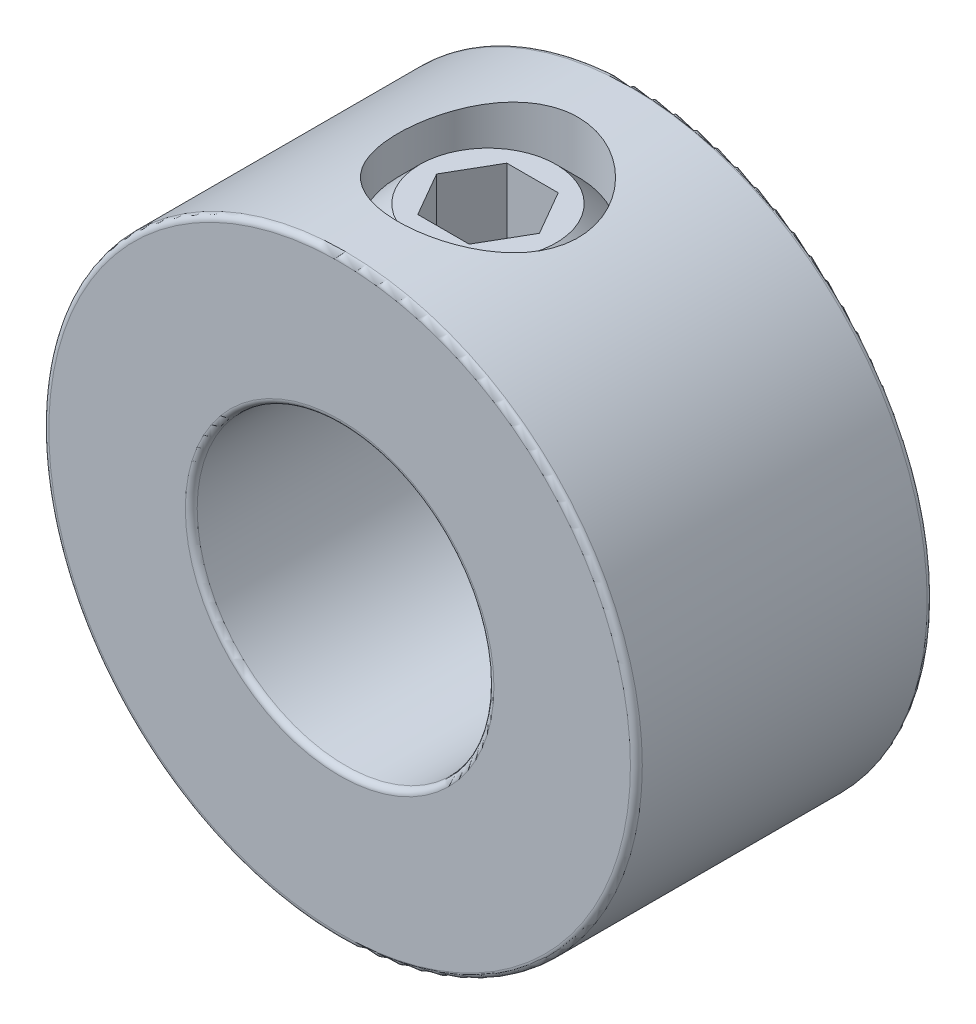
ISO-10303-21;
HEADER;
FILE_DESCRIPTION(('STEP AP214'),'2;1');
FILE_NAME('part.step','',(''),(''),'','','');
FILE_SCHEMA(('AUTOMOTIVE_DESIGN { 1 0 10303 214 1 1 1 1 }'));
ENDSEC;
DATA;
#1=APPLICATION_CONTEXT('core data for automotive mechanical design processes');
#2=APPLICATION_PROTOCOL_DEFINITION('international standard','automotive_design',2000,#1);
#3=PRODUCT_CONTEXT('',#1,'mechanical');
#4=PRODUCT('Part','Part','',(#3));
#5=PRODUCT_RELATED_PRODUCT_CATEGORY('part','',(#4));
#6=PRODUCT_DEFINITION_FORMATION('','',#4);
#7=PRODUCT_DEFINITION_CONTEXT('part definition',#1,'design');
#8=PRODUCT_DEFINITION('design','',#6,#7);
#9=PRODUCT_DEFINITION_SHAPE('','',#8);
#10=(LENGTH_UNIT() NAMED_UNIT(*) SI_UNIT(.MILLI.,.METRE.));
#11=(NAMED_UNIT(*) PLANE_ANGLE_UNIT() SI_UNIT($,.RADIAN.));
#12=(NAMED_UNIT(*) SI_UNIT($,.STERADIAN.) SOLID_ANGLE_UNIT());
#13=UNCERTAINTY_MEASURE_WITH_UNIT(LENGTH_MEASURE(1.E-05),#10,'distance_accuracy_value','');
#14=(GEOMETRIC_REPRESENTATION_CONTEXT(3) GLOBAL_UNCERTAINTY_ASSIGNED_CONTEXT((#13)) GLOBAL_UNIT_ASSIGNED_CONTEXT((#10,
#11,#12)) REPRESENTATION_CONTEXT('',''));
#15=CARTESIAN_POINT('',(0.,0.,0.));
#16=DIRECTION('',(0.,0.,1.));
#17=DIRECTION('',(1.,0.,0.));
#18=AXIS2_PLACEMENT_3D('',#15,#16,#17);
#19=CARTESIAN_POINT('',(0.,7.14375,0.));
#20=DIRECTION('',(0.,1.,0.));
#21=DIRECTION('',(-1.,0.,0.));
#22=AXIS2_PLACEMENT_3D('',#19,#20,#21);
#23=PLANE('',#22);
#24=CARTESIAN_POINT('',(0.,7.14375,0.));
#25=DIRECTION('',(0.,1.,0.));
#26=DIRECTION('',(-1.,0.,0.));
#27=AXIS2_PLACEMENT_3D('',#24,#25,#26);
#28=CIRCLE('',#27,1.81975161629017);
#29=CARTESIAN_POINT('',(-1.81975161629017,7.14375,0.));
#30=VERTEX_POINT('',#29);
#31=EDGE_CURVE('E12',#30,#30,#28,.T.);
#32=ORIENTED_EDGE('',*,*,#31,.T.);
#33=EDGE_LOOP('',(#32));
#34=FACE_BOUND('',#33,.T.);
#35=DIRECTION('',(1.,0.,0.));
#36=VECTOR('',#35,1.);
#37=CARTESIAN_POINT('',(-0.687407664253899,7.14374999999999,-1.190625));
#38=LINE('',#37,#36);
#39=CARTESIAN_POINT('',(-0.687407664253899,7.14374999999999,-1.190625));
#40=VERTEX_POINT('',#39);
#41=CARTESIAN_POINT('',(0.687407664253899,7.14375,-1.190625));
#42=VERTEX_POINT('',#41);
#43=EDGE_CURVE('E110',#40,#42,#38,.T.);
#44=ORIENTED_EDGE('',*,*,#43,.T.);
#45=DIRECTION('',(0.5,0.,0.866025403784439));
#46=VECTOR('',#45,1.);
#47=CARTESIAN_POINT('',(0.687407664253899,7.14374999999999,-1.190625));
#48=LINE('',#47,#46);
#49=CARTESIAN_POINT('',(1.3748153285078,7.14374999999999,0.));
#50=VERTEX_POINT('',#49);
#51=EDGE_CURVE('E56',#42,#50,#48,.T.);
#52=ORIENTED_EDGE('',*,*,#51,.T.);
#53=DIRECTION('',(-0.5,0.,0.866025403784439));
#54=VECTOR('',#53,1.);
#55=CARTESIAN_POINT('',(1.3748153285078,7.14374999999999,0.));
#56=LINE('',#55,#54);
#57=CARTESIAN_POINT('',(0.687407664253899,7.14374999999999,1.190625));
#58=VERTEX_POINT('',#57);
#59=EDGE_CURVE('E114',#50,#58,#56,.T.);
#60=ORIENTED_EDGE('',*,*,#59,.T.);
#61=DIRECTION('',(-1.,0.,0.));
#62=VECTOR('',#61,1.);
#63=CARTESIAN_POINT('',(0.687407664253899,7.14374999999999,1.190625));
#64=LINE('',#63,#62);
#65=CARTESIAN_POINT('',(-0.687407664253899,7.14374999999999,1.190625));
#66=VERTEX_POINT('',#65);
#67=EDGE_CURVE('E177',#58,#66,#64,.T.);
#68=ORIENTED_EDGE('',*,*,#67,.T.);
#69=DIRECTION('',(-0.5,0.,-0.866025403784439));
#70=VECTOR('',#69,1.);
#71=CARTESIAN_POINT('',(-0.687407664253899,7.14374999999999,1.190625));
#72=LINE('',#71,#70);
#73=CARTESIAN_POINT('',(-1.3748153285078,7.14374999999999,0.));
#74=VERTEX_POINT('',#73);
#75=EDGE_CURVE('E162',#66,#74,#72,.T.);
#76=ORIENTED_EDGE('',*,*,#75,.T.);
#77=DIRECTION('',(0.5,0.,-0.866025403784439));
#78=VECTOR('',#77,1.);
#79=CARTESIAN_POINT('',(-1.3748153285078,7.14374999999999,0.));
#80=LINE('',#79,#78);
#81=EDGE_CURVE('E158',#74,#40,#80,.T.);
#82=ORIENTED_EDGE('',*,*,#81,.T.);
#83=EDGE_LOOP('',(#44,#52,#60,#68,#76,#82));
#84=FACE_BOUND('',#83,.T.);
#85=ADVANCED_FACE('F42',(#34,#84),#23,.T.);
#86=CARTESIAN_POINT('',(0.,7.14375,0.));
#87=DIRECTION('',(0.,-1.,0.));
#88=DIRECTION('',(1.,0.,0.));
#89=AXIS2_PLACEMENT_3D('',#86,#87,#88);
#90=CONICAL_SURFACE('',#89,1.81975161629017,0.785398163397449);
#91=CARTESIAN_POINT('',(0.,6.55050161629017,0.));
#92=DIRECTION('',(0.,1.,0.));
#93=DIRECTION('',(-1.,0.,0.));
#94=AXIS2_PLACEMENT_3D('',#91,#92,#93);
#95=CIRCLE('',#94,2.413);
#96=CARTESIAN_POINT('',(-2.413,6.55050161629017,0.));
#97=VERTEX_POINT('',#96);
#98=EDGE_CURVE('E49',#97,#97,#95,.T.);
#99=ORIENTED_EDGE('',*,*,#98,.T.);
#100=EDGE_LOOP('',(#99));
#101=FACE_BOUND('',#100,.T.);
#102=ORIENTED_EDGE('',*,*,#31,.F.);
#103=EDGE_LOOP('',(#102));
#104=FACE_BOUND('',#103,.T.);
#105=ADVANCED_FACE('F132',(#101,#104),#90,.T.);
#106=CARTESIAN_POINT('',(0.,3.96875,0.));
#107=DIRECTION('',(0.,1.,0.));
#108=DIRECTION('',(-1.,0.,0.));
#109=AXIS2_PLACEMENT_3D('',#106,#107,#108);
#110=CYLINDRICAL_SURFACE('',#109,2.413);
#111=CARTESIAN_POINT('',(0.,4.56199838370983,0.));
#112=DIRECTION('',(0.,1.,0.));
#113=DIRECTION('',(-1.,0.,0.));
#114=AXIS2_PLACEMENT_3D('',#111,#112,#113);
#115=CIRCLE('',#114,2.413);
#116=CARTESIAN_POINT('',(-2.413,4.56199838370983,0.));
#117=VERTEX_POINT('',#116);
#118=EDGE_CURVE('E127',#117,#117,#115,.T.);
#119=ORIENTED_EDGE('',*,*,#118,.T.);
#120=EDGE_LOOP('',(#119));
#121=FACE_BOUND('',#120,.T.);
#122=ORIENTED_EDGE('',*,*,#98,.F.);
#123=EDGE_LOOP('',(#122));
#124=FACE_BOUND('',#123,.T.);
#125=ADVANCED_FACE('F135',(#121,#124),#110,.T.);
#126=CARTESIAN_POINT('',(0.,4.56199838370983,0.));
#127=DIRECTION('',(0.,1.,0.));
#128=DIRECTION('',(-1.,0.,0.));
#129=AXIS2_PLACEMENT_3D('',#126,#127,#128);
#130=CONICAL_SURFACE('',#129,2.413,0.785398163397449);
#131=CARTESIAN_POINT('',(0.,3.96875,0.));
#132=DIRECTION('',(0.,1.,0.));
#133=DIRECTION('',(-1.,0.,0.));
#134=AXIS2_PLACEMENT_3D('',#131,#132,#133);
#135=CIRCLE('',#134,1.81975161629017);
#136=CARTESIAN_POINT('',(-1.81975161629017,3.96875,0.));
#137=VERTEX_POINT('',#136);
#138=EDGE_CURVE('E119',#137,#137,#135,.T.);
#139=ORIENTED_EDGE('',*,*,#138,.T.);
#140=EDGE_LOOP('',(#139));
#141=FACE_BOUND('',#140,.T.);
#142=ORIENTED_EDGE('',*,*,#118,.F.);
#143=EDGE_LOOP('',(#142));
#144=FACE_BOUND('',#143,.T.);
#145=ADVANCED_FACE('F137',(#141,#144),#130,.T.);
#146=CARTESIAN_POINT('',(-1.81975161629017,3.96875,0.));
#147=DIRECTION('',(0.,-1.,0.));
#148=DIRECTION('',(1.,0.,0.));
#149=AXIS2_PLACEMENT_3D('',#146,#147,#148);
#150=PLANE('',#149);
#151=CARTESIAN_POINT('',(0.,3.96875,0.));
#152=DIRECTION('',(0.,1.,0.));
#153=DIRECTION('',(-1.,0.,0.));
#154=AXIS2_PLACEMENT_3D('',#151,#152,#153);
#155=CIRCLE('',#154,0.711898060451796);
#156=CARTESIAN_POINT('',(-0.711898060451796,3.96875,0.));
#157=VERTEX_POINT('',#156);
#158=EDGE_CURVE('E115',#157,#157,#155,.T.);
#159=ORIENTED_EDGE('',*,*,#158,.T.);
#160=EDGE_LOOP('',(#159));
#161=FACE_BOUND('',#160,.T.);
#162=ORIENTED_EDGE('',*,*,#138,.F.);
#163=EDGE_LOOP('',(#162));
#164=FACE_BOUND('',#163,.T.);
#165=ADVANCED_FACE('F144',(#161,#164),#150,.T.);
#166=CARTESIAN_POINT('',(0.,3.96875,0.));
#167=DIRECTION('',(0.,-1.,0.));
#168=DIRECTION('',(1.,0.,0.));
#169=AXIS2_PLACEMENT_3D('',#166,#167,#168);
#170=CONICAL_SURFACE('',#169,0.711898060451796,0.785398163397448);
#171=CARTESIAN_POINT('',(0.,4.6806480604518,0.));
#172=VERTEX_POINT('',#171);
#173=VERTEX_LOOP('',#172);
#174=FACE_BOUND('',#173,.T.);
#175=ORIENTED_EDGE('',*,*,#158,.F.);
#176=EDGE_LOOP('',(#175));
#177=FACE_BOUND('',#176,.T.);
#178=ADVANCED_FACE('F211',(#174,#177),#170,.F.);
#179=CARTESIAN_POINT('',(0.687407664253899,4.76249999999999,-1.190625));
#180=DIRECTION('',(-0.866025403784439,0.,0.5));
#181=DIRECTION('',(0.5,0.,0.866025403784438));
#182=AXIS2_PLACEMENT_3D('',#179,#180,#181);
#183=PLANE('',#182);
#184=ORIENTED_EDGE('',*,*,#51,.F.);
#185=DIRECTION('',(0.,1.,0.));
#186=VECTOR('',#185,1.);
#187=CARTESIAN_POINT('',(0.687407664253899,4.76249999999999,-1.190625));
#188=LINE('',#187,#186);
#189=CARTESIAN_POINT('',(0.687407664253899,4.76249999999999,-1.190625));
#190=VERTEX_POINT('',#189);
#191=EDGE_CURVE('E109',#190,#42,#188,.T.);
#192=ORIENTED_EDGE('',*,*,#191,.F.);
#193=DIRECTION('',(0.5,0.,0.866025403784439));
#194=VECTOR('',#193,1.);
#195=CARTESIAN_POINT('',(0.687407664253899,4.76249999999999,-1.190625));
#196=LINE('',#195,#194);
#197=CARTESIAN_POINT('',(1.3748153285078,4.76249999999999,0.));
#198=VERTEX_POINT('',#197);
#199=EDGE_CURVE('E100',#190,#198,#196,.T.);
#200=ORIENTED_EDGE('',*,*,#199,.T.);
#201=DIRECTION('',(0.,1.,0.));
#202=VECTOR('',#201,1.);
#203=CARTESIAN_POINT('',(1.3748153285078,4.76249999999999,0.));
#204=LINE('',#203,#202);
#205=EDGE_CURVE('E108',#198,#50,#204,.T.);
#206=ORIENTED_EDGE('',*,*,#205,.T.);
#207=EDGE_LOOP('',(#184,#192,#200,#206));
#208=FACE_BOUND('',#207,.T.);
#209=ADVANCED_FACE('F107',(#208),#183,.T.);
#210=CARTESIAN_POINT('',(1.3748153285078,4.76249999999999,0.));
#211=DIRECTION('',(-0.866025403784439,0.,-0.5));
#212=DIRECTION('',(-0.5,0.,0.866025403784439));
#213=AXIS2_PLACEMENT_3D('',#210,#211,#212);
#214=PLANE('',#213);
#215=ORIENTED_EDGE('',*,*,#59,.F.);
#216=ORIENTED_EDGE('',*,*,#205,.F.);
#217=DIRECTION('',(-0.5,0.,0.866025403784439));
#218=VECTOR('',#217,1.);
#219=CARTESIAN_POINT('',(1.3748153285078,4.76249999999999,0.));
#220=LINE('',#219,#218);
#221=CARTESIAN_POINT('',(0.687407664253899,4.76249999999999,1.190625));
#222=VERTEX_POINT('',#221);
#223=EDGE_CURVE('E96',#198,#222,#220,.T.);
#224=ORIENTED_EDGE('',*,*,#223,.T.);
#225=DIRECTION('',(0.,1.,0.));
#226=VECTOR('',#225,1.);
#227=CARTESIAN_POINT('',(0.687407664253899,4.76249999999999,1.190625));
#228=LINE('',#227,#226);
#229=EDGE_CURVE('E116',#222,#58,#228,.T.);
#230=ORIENTED_EDGE('',*,*,#229,.T.);
#231=EDGE_LOOP('',(#215,#216,#224,#230));
#232=FACE_BOUND('',#231,.T.);
#233=ADVANCED_FACE('F112',(#232),#214,.T.);
#234=CARTESIAN_POINT('',(0.687407664253899,4.76249999999999,1.190625));
#235=DIRECTION('',(0.,0.,-1.));
#236=DIRECTION('',(-1.,0.,0.));
#237=AXIS2_PLACEMENT_3D('',#234,#235,#236);
#238=PLANE('',#237);
#239=ORIENTED_EDGE('',*,*,#67,.F.);
#240=ORIENTED_EDGE('',*,*,#229,.F.);
#241=DIRECTION('',(-1.,0.,0.));
#242=VECTOR('',#241,1.);
#243=CARTESIAN_POINT('',(0.687407664253899,4.76249999999999,1.190625));
#244=LINE('',#243,#242);
#245=CARTESIAN_POINT('',(-0.687407664253899,4.76249999999999,1.190625));
#246=VERTEX_POINT('',#245);
#247=EDGE_CURVE('E102',#222,#246,#244,.T.);
#248=ORIENTED_EDGE('',*,*,#247,.T.);
#249=DIRECTION('',(0.,1.,0.));
#250=VECTOR('',#249,1.);
#251=CARTESIAN_POINT('',(-0.687407664253899,4.76249999999999,1.190625));
#252=LINE('',#251,#250);
#253=EDGE_CURVE('E121',#246,#66,#252,.T.);
#254=ORIENTED_EDGE('',*,*,#253,.T.);
#255=EDGE_LOOP('',(#239,#240,#248,#254));
#256=FACE_BOUND('',#255,.T.);
#257=ADVANCED_FACE('F175',(#256),#238,.T.);
#258=CARTESIAN_POINT('',(-0.687407664253899,4.76249999999999,1.190625));
#259=DIRECTION('',(0.866025403784439,0.,-0.5));
#260=DIRECTION('',(-0.5,0.,-0.866025403784438));
#261=AXIS2_PLACEMENT_3D('',#258,#259,#260);
#262=PLANE('',#261);
#263=ORIENTED_EDGE('',*,*,#75,.F.);
#264=ORIENTED_EDGE('',*,*,#253,.F.);
#265=DIRECTION('',(-0.5,0.,-0.866025403784439));
#266=VECTOR('',#265,1.);
#267=CARTESIAN_POINT('',(-0.687407664253899,4.76249999999999,1.190625));
#268=LINE('',#267,#266);
#269=CARTESIAN_POINT('',(-1.3748153285078,4.76249999999999,0.));
#270=VERTEX_POINT('',#269);
#271=EDGE_CURVE('E188',#246,#270,#268,.T.);
#272=ORIENTED_EDGE('',*,*,#271,.T.);
#273=DIRECTION('',(0.,1.,0.));
#274=VECTOR('',#273,1.);
#275=CARTESIAN_POINT('',(-1.3748153285078,4.76249999999999,0.));
#276=LINE('',#275,#274);
#277=EDGE_CURVE('E170',#270,#74,#276,.T.);
#278=ORIENTED_EDGE('',*,*,#277,.T.);
#279=EDGE_LOOP('',(#263,#264,#272,#278));
#280=FACE_BOUND('',#279,.T.);
#281=ADVANCED_FACE('F179',(#280),#262,.T.);
#282=CARTESIAN_POINT('',(-1.3748153285078,4.76249999999999,0.));
#283=DIRECTION('',(0.866025403784439,0.,0.5));
#284=DIRECTION('',(0.5,0.,-0.866025403784439));
#285=AXIS2_PLACEMENT_3D('',#282,#283,#284);
#286=PLANE('',#285);
#287=ORIENTED_EDGE('',*,*,#81,.F.);
#288=ORIENTED_EDGE('',*,*,#277,.F.);
#289=DIRECTION('',(0.5,0.,-0.866025403784439));
#290=VECTOR('',#289,1.);
#291=CARTESIAN_POINT('',(-1.3748153285078,4.76249999999999,0.));
#292=LINE('',#291,#290);
#293=CARTESIAN_POINT('',(-0.687407664253899,4.76249999999999,-1.190625));
#294=VERTEX_POINT('',#293);
#295=EDGE_CURVE('E186',#270,#294,#292,.T.);
#296=ORIENTED_EDGE('',*,*,#295,.T.);
#297=DIRECTION('',(0.,1.,0.));
#298=VECTOR('',#297,1.);
#299=CARTESIAN_POINT('',(-0.687407664253899,4.76249999999999,-1.190625));
#300=LINE('',#299,#298);
#301=EDGE_CURVE('E167',#294,#40,#300,.T.);
#302=ORIENTED_EDGE('',*,*,#301,.T.);
#303=EDGE_LOOP('',(#287,#288,#296,#302));
#304=FACE_BOUND('',#303,.T.);
#305=ADVANCED_FACE('F192',(#304),#286,.T.);
#306=CARTESIAN_POINT('',(-0.687407664253899,4.76249999999999,-1.190625));
#307=DIRECTION('',(0.,0.,1.));
#308=DIRECTION('',(1.,0.,0.));
#309=AXIS2_PLACEMENT_3D('',#306,#307,#308);
#310=PLANE('',#309);
#311=ORIENTED_EDGE('',*,*,#43,.F.);
#312=ORIENTED_EDGE('',*,*,#301,.F.);
#313=DIRECTION('',(1.,0.,0.));
#314=VECTOR('',#313,1.);
#315=CARTESIAN_POINT('',(-0.687407664253899,4.76249999999999,-1.190625));
#316=LINE('',#315,#314);
#317=EDGE_CURVE('E168',#294,#190,#316,.T.);
#318=ORIENTED_EDGE('',*,*,#317,.T.);
#319=ORIENTED_EDGE('',*,*,#191,.T.);
#320=EDGE_LOOP('',(#311,#312,#318,#319));
#321=FACE_BOUND('',#320,.T.);
#322=ADVANCED_FACE('F193',(#321),#310,.T.);
#323=CARTESIAN_POINT('',(1.3748153285078,4.76249999999999,0.));
#324=DIRECTION('',(0.,-1.,0.));
#325=DIRECTION('',(0.,0.,-1.));
#326=AXIS2_PLACEMENT_3D('',#323,#324,#325);
#327=PLANE('',#326);
#328=ORIENTED_EDGE('',*,*,#199,.F.);
#329=ORIENTED_EDGE('',*,*,#317,.F.);
#330=ORIENTED_EDGE('',*,*,#295,.F.);
#331=ORIENTED_EDGE('',*,*,#271,.F.);
#332=ORIENTED_EDGE('',*,*,#247,.F.);
#333=ORIENTED_EDGE('',*,*,#223,.F.);
#334=EDGE_LOOP('',(#328,#329,#330,#331,#332,#333));
#335=FACE_BOUND('',#334,.T.);
#336=ADVANCED_FACE('F98',(#335),#327,.F.);
#337=CLOSED_SHELL('',(#85,#105,#125,#145,#165,#178,#209,#233,#257,#281,#305,#322,#336));
#338=MANIFOLD_SOLID_BREP('B2',#337);
#339=CARTESIAN_POINT('',(0.,0.,3.96875));
#340=DIRECTION('',(0.,0.,1.));
#341=DIRECTION('',(1.,0.,0.));
#342=AXIS2_PLACEMENT_3D('',#339,#340,#341);
#343=PLANE('',#342);
#344=CARTESIAN_POINT('',(0.,0.,3.96875));
#345=DIRECTION('',(0.,0.,1.));
#346=DIRECTION('',(1.,0.,0.));
#347=AXIS2_PLACEMENT_3D('',#344,#345,#346);
#348=CIRCLE('',#347,4.1275);
#349=CARTESIAN_POINT('',(4.1275,0.,3.96875));
#350=VERTEX_POINT('',#349);
#351=EDGE_CURVE('E307',#350,#350,#348,.F.);
#352=ORIENTED_EDGE('',*,*,#351,.T.);
#353=EDGE_LOOP('',(#352));
#354=FACE_BOUND('',#353,.T.);
#355=CARTESIAN_POINT('',(0.,0.,3.96875));
#356=DIRECTION('',(0.,0.,1.));
#357=DIRECTION('',(1.,0.,0.));
#358=AXIS2_PLACEMENT_3D('',#355,#356,#357);
#359=CIRCLE('',#358,7.77875);
#360=CARTESIAN_POINT('',(7.77875,0.,3.96875));
#361=VERTEX_POINT('',#360);
#362=EDGE_CURVE('E311',#361,#361,#359,.T.);
#363=ORIENTED_EDGE('',*,*,#362,.T.);
#364=EDGE_LOOP('',(#363));
#365=FACE_BOUND('',#364,.T.);
#366=ADVANCED_FACE('F296',(#354,#365),#343,.T.);
#367=CARTESIAN_POINT('',(0.,0.,-3.96875));
#368=DIRECTION('',(0.,0.,1.));
#369=DIRECTION('',(1.,0.,0.));
#370=AXIS2_PLACEMENT_3D('',#367,#368,#369);
#371=PLANE('',#370);
#372=CARTESIAN_POINT('',(0.,0.,-3.96875));
#373=DIRECTION('',(0.,0.,1.));
#374=DIRECTION('',(1.,0.,0.));
#375=AXIS2_PLACEMENT_3D('',#372,#373,#374);
#376=CIRCLE('',#375,4.1275);
#377=CARTESIAN_POINT('',(4.1275,0.,-3.96875));
#378=VERTEX_POINT('',#377);
#379=EDGE_CURVE('E322',#378,#378,#376,.T.);
#380=ORIENTED_EDGE('',*,*,#379,.T.);
#381=EDGE_LOOP('',(#380));
#382=FACE_BOUND('',#381,.T.);
#383=CARTESIAN_POINT('',(0.,0.,-3.96875));
#384=DIRECTION('',(0.,0.,1.));
#385=DIRECTION('',(1.,0.,0.));
#386=AXIS2_PLACEMENT_3D('',#383,#384,#385);
#387=CIRCLE('',#386,7.77875);
#388=CARTESIAN_POINT('',(7.77875,0.,-3.96875));
#389=VERTEX_POINT('',#388);
#390=EDGE_CURVE('E325',#389,#389,#387,.F.);
#391=ORIENTED_EDGE('',*,*,#390,.T.);
#392=EDGE_LOOP('',(#391));
#393=FACE_BOUND('',#392,.T.);
#394=ADVANCED_FACE('F359',(#382,#393),#371,.F.);
#395=CARTESIAN_POINT('',(0.,0.,3.96875));
#396=DIRECTION('',(0.,0.,-1.));
#397=DIRECTION('',(-1.,0.,0.));
#398=AXIS2_PLACEMENT_3D('',#395,#396,#397);
#399=CYLINDRICAL_SURFACE('',#398,7.9375);
#400=CARTESIAN_POINT('',(0.,0.,-3.81));
#401=DIRECTION('',(0.,0.,1.));
#402=DIRECTION('',(1.,0.,0.));
#403=AXIS2_PLACEMENT_3D('',#400,#401,#402);
#404=CIRCLE('',#403,7.9375);
#405=CARTESIAN_POINT('',(7.9375,0.,-3.81));
#406=VERTEX_POINT('',#405);
#407=EDGE_CURVE('E41',#406,#406,#404,.T.);
#408=ORIENTED_EDGE('',*,*,#407,.T.);
#409=EDGE_LOOP('',(#408));
#410=FACE_BOUND('',#409,.T.);
#411=CARTESIAN_POINT('',(0.,0.,3.81));
#412=DIRECTION('',(0.,0.,1.));
#413=DIRECTION('',(1.,0.,0.));
#414=AXIS2_PLACEMENT_3D('',#411,#412,#413);
#415=CIRCLE('',#414,7.9375);
#416=CARTESIAN_POINT('',(7.9375,0.,3.81));
#417=VERTEX_POINT('',#416);
#418=EDGE_CURVE('E303',#417,#417,#415,.F.);
#419=ORIENTED_EDGE('',*,*,#418,.T.);
#420=EDGE_LOOP('',(#419));
#421=FACE_BOUND('',#420,.T.);
#422=CARTESIAN_POINT('',(0.,7.9375,-2.413));
#423=CARTESIAN_POINT('',(0.132292774899317,7.9374990050537,-2.41299862237628));
#424=CARTESIAN_POINT('',(0.264599518381689,7.93416116207132,-2.40208456794969));
#425=CARTESIAN_POINT('',(0.525354946013904,7.92117222946042,-2.35882374345716));
#426=CARTESIAN_POINT('',(0.653802557415082,7.91151940108894,-2.32647107053551));
#427=CARTESIAN_POINT('',(0.903041313331836,7.88695717599938,-2.24151680045489));
#428=CARTESIAN_POINT('',(1.0238436159252,7.87205565851205,-2.18894554423122));
#429=CARTESIAN_POINT('',(1.25491860814633,7.83854164816898,-2.06517231127943));
#430=CARTESIAN_POINT('',(1.36518981088764,7.81992863242886,-1.99396770900084));
#431=CARTESIAN_POINT('',(1.5753146010731,7.78036198161428,-1.83274390297987));
#432=CARTESIAN_POINT('',(1.67481494525514,7.75935941289957,-1.74227635763322));
#433=CARTESIAN_POINT('',(1.85749109856336,7.71766998618262,-1.54604996654896));
#434=CARTESIAN_POINT('',(1.9406640704021,7.69698318362761,-1.44028846864199));
#435=CARTESIAN_POINT('',(2.09020118290126,7.65774749745578,-1.21346560478497));
#436=CARTESIAN_POINT('',(2.15613096597831,7.63925929192144,-1.09210639523313));
#437=CARTESIAN_POINT('',(2.26650098404084,7.60724691943917,-0.839370407786386));
#438=CARTESIAN_POINT('',(2.31094653649145,7.59372152436824,-0.707996118007792));
#439=CARTESIAN_POINT('',(2.3758067264602,7.57367670858706,-0.442932068104457));
#440=CARTESIAN_POINT('',(2.39687388308448,7.56696751920921,-0.309416717357086));
#441=CARTESIAN_POINT('',(2.4164171516007,7.56075056418472,-0.0405910256843933));
#442=CARTESIAN_POINT('',(2.41489890338842,7.56124100068904,0.0947188586885998));
#443=CARTESIAN_POINT('',(2.38982629949606,7.56919991114954,0.357957705592921));
#444=CARTESIAN_POINT('',(2.36709319986061,7.57640830969674,0.485974062421038));
#445=CARTESIAN_POINT('',(2.30156455882043,7.59656963695107,0.736282348204517));
#446=CARTESIAN_POINT('',(2.25876698945115,7.60952314632332,0.858573697144985));
#447=CARTESIAN_POINT('',(2.15372728275048,7.63992010283533,1.09595275882303));
#448=CARTESIAN_POINT('',(2.09122148030352,7.65742383164637,1.21091575085397));
#449=CARTESIAN_POINT('',(1.94872282727374,7.6949204514905,1.42899447413862));
#450=CARTESIAN_POINT('',(1.86872564146393,7.71491395908373,1.53210725864378));
#451=CARTESIAN_POINT('',(1.68945173313376,7.75618852856768,1.72821183511834));
#452=CARTESIAN_POINT('',(1.58949459558667,7.77748801126888,1.82057882521009));
#453=CARTESIAN_POINT('',(1.37524410592773,7.81821490430143,1.98738656746316));
#454=CARTESIAN_POINT('',(1.26094980324712,7.83764219035306,2.0618261300612));
#455=CARTESIAN_POINT('',(1.0201121910355,7.87262138541946,2.19105912538642));
#456=CARTESIAN_POINT('',(0.893488365352983,7.88814506930487,2.24571066163077));
#457=CARTESIAN_POINT('',(0.632264385940609,7.91336446499524,2.3327557354663));
#458=CARTESIAN_POINT('',(0.497666531143089,7.92306184764078,2.36515565465833));
#459=CARTESIAN_POINT('',(0.229624252219485,7.93527028493288,2.40572996828062));
#460=CARTESIAN_POINT('',(0.09631920362542,7.93803232635549,2.41475084587308));
#461=CARTESIAN_POINT('',(-0.169910326320387,7.93679710103237,2.41068803034094));
#462=CARTESIAN_POINT('',(-0.30283485746222,7.93280076329333,2.39760737529289));
#463=CARTESIAN_POINT('',(-0.561313045757695,7.918662317796,2.35039574306306));
#464=CARTESIAN_POINT('',(-0.686966276089901,7.9086655503028,2.31676225166702));
#465=CARTESIAN_POINT('',(-0.930816403381333,7.88368716256098,2.23000090507394));
#466=CARTESIAN_POINT('',(-1.04901239362654,7.86870493752267,2.17687068463324));
#467=CARTESIAN_POINT('',(-1.27768494619444,7.83486511139573,2.05122165093958));
#468=CARTESIAN_POINT('',(-1.38791430468818,7.81592458790179,1.97827588105506));
#469=CARTESIAN_POINT('',(-1.59485450866657,7.77634000763052,1.81558313194289));
#470=CARTESIAN_POINT('',(-1.69156186567424,7.75569551343041,1.72583183105413));
#471=CARTESIAN_POINT('',(-1.87245924486539,7.71406179196385,1.52809707336634));
#472=CARTESIAN_POINT('',(-1.95604664764415,7.69308849985636,1.41955774085528));
#473=CARTESIAN_POINT('',(-2.10386717742399,7.65398694583366,1.18953707022205));
#474=CARTESIAN_POINT('',(-2.16810075387635,7.63585861785491,1.06805603273204));
#475=CARTESIAN_POINT('',(-2.27496230406853,7.6047061861998,0.815946913466264));
#476=CARTESIAN_POINT('',(-2.31768600255476,7.59165952754718,0.685362356123388));
#477=CARTESIAN_POINT('',(-2.38040189821885,7.57223163077592,0.418379500826614));
#478=CARTESIAN_POINT('',(-2.40040215315239,7.56584802999566,0.281983281505183));
#479=CARTESIAN_POINT('',(-2.41654573186451,7.56070606206809,0.0135215462387282));
#480=CARTESIAN_POINT('',(-2.41367335403041,7.56163307372804,-0.11847951451985));
#481=CARTESIAN_POINT('',(-2.38651114002636,7.57024895804181,-0.380023066349805));
#482=CARTESIAN_POINT('',(-2.36222220501566,7.57793754618407,-0.509565660633487));
#483=CARTESIAN_POINT('',(-2.29355931064324,7.5989964058365,-0.76085836843846));
#484=CARTESIAN_POINT('',(-2.24945261375918,7.61229093341087,-0.882688328499914));
#485=CARTESIAN_POINT('',(-2.14261496851981,7.64304804543904,-1.11731626044873));
#486=CARTESIAN_POINT('',(-2.07988038265957,7.66051144382583,-1.23011246282902));
#487=CARTESIAN_POINT('',(-1.93482964223909,7.69845124150092,-1.44802165282358));
#488=CARTESIAN_POINT('',(-1.85187057120019,7.71901570680081,-1.55269133387613));
#489=CARTESIAN_POINT('',(-1.66987475949574,7.76042016207134,-1.74694286232239));
#490=CARTESIAN_POINT('',(-1.57083380768261,7.78126022289201,-1.83652074527573));
#491=CARTESIAN_POINT('',(-1.35587248164352,7.82162492221923,-2.00075462812685));
#492=CARTESIAN_POINT('',(-1.239531599163,7.84109057268621,-2.07487627262594));
#493=CARTESIAN_POINT('',(-0.995447775442171,7.87579500420969,-2.20240594981202));
#494=CARTESIAN_POINT('',(-0.867709932888345,7.89103566300204,-2.25582318848638));
#495=CARTESIAN_POINT('',(-0.617657643652073,7.91432673031083,-2.33592468921693));
#496=CARTESIAN_POINT('',(-0.496078219783341,7.92294375396858,-2.364748063768));
#497=CARTESIAN_POINT('',(-0.249669622610166,7.93453035635686,-2.40328467078255));
#498=CARTESIAN_POINT('',(-0.12484103093866,7.93750093890329,-2.41300130002538));
#499=CARTESIAN_POINT('',(0.,7.9375,-2.413));
#500=B_SPLINE_CURVE_WITH_KNOTS('',3,(#422,#423,#424,#425,#426,#427,#428,#429,#430,#431,#432,
#433,#434,#435,#436,#437,#438,#439,#440,#441,#442,#443,#444,#445,#446,#447,#448,#449,#450,#451,
#452,#453,#454,#455,#456,#457,#458,#459,#460,#461,#462,#463,#464,#465,#466,#467,#468,#469,#470,
#471,#472,#473,#474,#475,#476,#477,#478,#479,#480,#481,#482,#483,#484,#485,#486,#487,#488,#489,
#490,#491,#492,#493,#494,#495,#496,#497,#498,#499),.UNSPECIFIED.,.T.,.F.,(4,2,2,2,2,2,2,2,2,2,2,
2,2,2,2,2,2,2,2,2,2,2,2,2,2,2,2,2,2,2,2,2,2,2,2,2,2,2,4),(0.,0.396419658797233,
0.792948512171322,1.18888462342481,1.5848765545249,1.99135590349126,2.39790582595712,
2.81388034303934,3.22975185135954,3.63369866570383,4.03754461049548,4.42637821024115,
4.81525111881571,5.20956461414611,5.60397595080319,6.01532502722272,6.42670139093795,
6.84097182422919,7.25512339812399,7.65405578815865,8.0529333454106,8.44251867756104,
8.83215128784881,9.230955625767,9.62986266023801,10.0436726713234,10.4574730718142,
10.8694153009928,11.2812114094117,11.6753852663269,12.0695425381084,12.4585367217993,
12.8476069151672,13.2511843609796,13.6548676571655,14.0707821958696,14.486511589997,
14.8606683757548,15.2347586382522),.UNSPECIFIED.);
#501=CARTESIAN_POINT('',(0.,7.9375,-2.413));
#502=VERTEX_POINT('',#501);
#503=EDGE_CURVE('E328',#502,#502,#500,.T.);
#504=ORIENTED_EDGE('',*,*,#503,.T.);
#505=EDGE_LOOP('',(#504));
#506=FACE_BOUND('',#505,.T.);
#507=ADVANCED_FACE('F355',(#410,#421,#506),#399,.T.);
#508=CARTESIAN_POINT('',(0.,0.,3.96875));
#509=DIRECTION('',(0.,0.,-1.));
#510=DIRECTION('',(-1.,0.,0.));
#511=AXIS2_PLACEMENT_3D('',#508,#509,#510);
#512=CYLINDRICAL_SURFACE('',#511,3.96875);
#513=CARTESIAN_POINT('',(0.,0.,-3.81));
#514=DIRECTION('',(0.,0.,1.));
#515=DIRECTION('',(1.,0.,0.));
#516=AXIS2_PLACEMENT_3D('',#513,#514,#515);
#517=CIRCLE('',#516,3.96875);
#518=CARTESIAN_POINT('',(3.96875,0.,-3.81));
#519=VERTEX_POINT('',#518);
#520=EDGE_CURVE('E316',#519,#519,#517,.F.);
#521=ORIENTED_EDGE('',*,*,#520,.T.);
#522=EDGE_LOOP('',(#521));
#523=FACE_BOUND('',#522,.T.);
#524=CARTESIAN_POINT('',(0.,0.,3.81));
#525=DIRECTION('',(0.,0.,1.));
#526=DIRECTION('',(1.,0.,0.));
#527=AXIS2_PLACEMENT_3D('',#524,#525,#526);
#528=CIRCLE('',#527,3.96875);
#529=CARTESIAN_POINT('',(3.96875,0.,3.81));
#530=VERTEX_POINT('',#529);
#531=EDGE_CURVE('E319',#530,#530,#528,.T.);
#532=ORIENTED_EDGE('',*,*,#531,.T.);
#533=EDGE_LOOP('',(#532));
#534=FACE_BOUND('',#533,.T.);
#535=CARTESIAN_POINT('',(0.,3.96875,-2.413));
#536=CARTESIAN_POINT('',(0.123165501550284,3.96874204339669,-2.41299124615945));
#537=CARTESIAN_POINT('',(0.246516738261875,3.96295429853951,-2.40350384959746));
#538=CARTESIAN_POINT('',(0.489483664080046,3.94034943987807,-2.36604326559291));
#539=CARTESIAN_POINT('',(0.609090127783646,3.92350703743669,-2.33802769196767));
#540=CARTESIAN_POINT('',(0.840546582386573,3.88049577993341,-2.26510491179092));
#541=CARTESIAN_POINT('',(0.952431828991632,3.8543732029897,-2.22028146179405));
#542=CARTESIAN_POINT('',(1.16673008430404,3.79500971512363,-2.11554934419897));
#543=CARTESIAN_POINT('',(1.26914501361637,3.76177025207777,-2.05564374451438));
#544=CARTESIAN_POINT('',(1.47058753111351,3.687916691379,-1.91729289743173));
#545=CARTESIAN_POINT('',(1.56873586524913,3.64693051913672,-1.83776986476495));
#546=CARTESIAN_POINT('',(1.75115925298086,3.56293790693084,-1.66488233877126));
#547=CARTESIAN_POINT('',(1.83541593933604,3.51992888739431,-1.57149982566307));
#548=CARTESIAN_POINT('',(1.99850147891552,3.43025832872789,-1.35964489661003));
#549=CARTESIAN_POINT('',(2.07529106286855,3.38382416372775,-1.23949270263077));
#550=CARTESIAN_POINT('',(2.20731894277433,3.29922586533873,-0.985260717608268));
#551=CARTESIAN_POINT('',(2.26259272815675,3.26104815989316,-0.851204327616272));
#552=CARTESIAN_POINT('',(2.33806142410285,3.2071858977595,-0.606725086153752));
#553=CARTESIAN_POINT('',(2.3635499927685,3.18827407496012,-0.498650940719577));
#554=CARTESIAN_POINT('',(2.3994244997262,3.16137002399118,-0.27874861563771));
#555=CARTESIAN_POINT('',(2.40983000472769,3.15336364939586,-0.166925492537775));
#556=CARTESIAN_POINT('',(2.41493016649177,3.14946076169536,0.0575392620475352));
#557=CARTESIAN_POINT('',(2.40959091684864,3.15359038345178,0.170182138134826));
#558=CARTESIAN_POINT('',(2.3834758297023,3.17336918561413,0.392656374086385));
#559=CARTESIAN_POINT('',(2.36268812164138,3.18902722434164,0.502485504705744));
#560=CARTESIAN_POINT('',(2.3072582560278,3.22934546748502,0.714839170566954));
#561=CARTESIAN_POINT('',(2.27284136966713,3.2538587555979,0.817452012053584));
#562=CARTESIAN_POINT('',(2.19144263462213,3.30922547315599,1.01569946550598));
#563=CARTESIAN_POINT('',(2.14445623611994,3.34008119745013,1.11133153463737));
#564=CARTESIAN_POINT('',(2.02958239720278,3.41132068401533,1.31107139668459));
#565=CARTESIAN_POINT('',(1.95946010965428,3.45242166708182,1.41363816272798));
#566=CARTESIAN_POINT('',(1.8046098923845,3.53583156997046,1.60663550750143));
#567=CARTESIAN_POINT('',(1.71986762893658,3.57814164091738,1.69705401960805));
#568=CARTESIAN_POINT('',(1.52341346023064,3.66652895599888,1.87670279125692));
#569=CARTESIAN_POINT('',(1.40956777558015,3.71224383147173,1.96379855427126));
#570=CARTESIAN_POINT('',(1.16600981934112,3.79577231057004,2.11746058126192));
#571=CARTESIAN_POINT('',(1.03630546031566,3.83358982922035,2.18403702528473));
#572=CARTESIAN_POINT('',(0.836657404029858,3.88011810238804,2.26436147855773));
#573=CARTESIAN_POINT('',(0.771445792482796,3.89363655503471,2.28741378555035));
#574=CARTESIAN_POINT('',(0.63877705404067,3.91758471873137,2.3279461715394));
#575=CARTESIAN_POINT('',(0.571321220958915,3.92801617627651,2.34542940172032));
#576=CARTESIAN_POINT('',(0.434774063004328,3.94546326769465,2.37453334076451));
#577=CARTESIAN_POINT('',(0.36568406213146,3.95248157377129,2.38615863614474));
#578=CARTESIAN_POINT('',(0.226511162532038,3.96289656392044,2.40336960926214));
#579=CARTESIAN_POINT('',(0.156428414099685,3.966293790382,2.40895619151915));
#580=CARTESIAN_POINT('',(-0.0345875094638976,3.97042803093639,2.41576593447406));
#581=CARTESIAN_POINT('',(-0.155889645087031,3.96750179775886,2.41097308037977));
#582=CARTESIAN_POINT('',(-0.395580786800256,3.95081788580082,2.38341492656171));
#583=CARTESIAN_POINT('',(-0.513969891060856,3.93706057254972,2.36065023335502));
#584=CARTESIAN_POINT('',(-0.741302925101665,3.9005543203932,2.29924007500009));
#585=CARTESIAN_POINT('',(-0.850420645087186,3.87807562396895,2.26107063451517));
#586=CARTESIAN_POINT('',(-1.06064649564909,3.82593168660241,2.17041877534692));
#587=CARTESIAN_POINT('',(-1.16175312592156,3.79626510372601,2.11793368378936));
#588=CARTESIAN_POINT('',(-1.36438293166863,3.72853735621207,1.99412771667006));
#589=CARTESIAN_POINT('',(-1.46487371909966,3.68992598646786,1.92142252874577));
#590=CARTESIAN_POINT('',(-1.6529744799132,3.60958967643982,1.76223036727608));
#591=CARTESIAN_POINT('',(-1.74056936405613,3.56786117353918,1.67572749194951));
#592=CARTESIAN_POINT('',(-1.91261918342017,3.4790009867155,1.47780510411286));
#593=CARTESIAN_POINT('',(-1.99504642611132,3.43190199283522,1.3645979373042));
#594=CARTESIAN_POINT('',(-2.13985097603664,3.34353376432047,1.12395576920229));
#595=CARTESIAN_POINT('',(-2.20224731258024,3.3022590176874,0.99653442736945));
#596=CARTESIAN_POINT('',(-2.29344177866512,3.23936579282098,0.758458757219687));
#597=CARTESIAN_POINT('',(-2.32657866306329,3.2154293082859,0.65008626694079));
#598=CARTESIAN_POINT('',(-2.37744086245656,3.17801315216161,0.428095724280517));
#599=CARTESIAN_POINT('',(-2.39518851540099,3.16451832725394,0.314485527906917));
#600=CARTESIAN_POINT('',(-2.4142849438641,3.14997859909978,0.0845648471209729));
#601=CARTESIAN_POINT('',(-2.41556252659962,3.14898774534438,-0.0317551842091482));
#602=CARTESIAN_POINT('',(-2.40143983741951,3.15976763622633,-0.262802510402487));
#603=CARTESIAN_POINT('',(-2.38603134047097,3.17154467451613,-0.377528991515132));
#604=CARTESIAN_POINT('',(-2.34087808899904,3.20499353082565,-0.595427565837474));
#605=CARTESIAN_POINT('',(-2.31201651153951,3.22605194545112,-0.698883891062723));
#606=CARTESIAN_POINT('',(-2.24159346468759,3.27537424028443,-0.899525378863215));
#607=CARTESIAN_POINT('',(-2.20002713060506,3.30364087985553,-0.996708121970213));
#608=CARTESIAN_POINT('',(-2.09815316530071,3.36941108076951,-1.19787071136103));
#609=CARTESIAN_POINT('',(-2.03595940923333,3.40766534627249,-1.30064658521609));
#610=CARTESIAN_POINT('',(-1.89759243380594,3.48661316283012,-1.49532299960668));
#611=CARTESIAN_POINT('',(-1.8214076316638,3.52730871602022,-1.58721442476447));
#612=CARTESIAN_POINT('',(-1.64167102002946,3.61490729831683,-1.77400508435351));
#613=CARTESIAN_POINT('',(-1.53566353730284,3.66165458052152,-1.8666319309591));
#614=CARTESIAN_POINT('',(-1.30733133465839,3.74923513415245,-2.03306755896813));
#615=CARTESIAN_POINT('',(-1.18499957660471,3.7900658387457,-2.1068681833466));
#616=CARTESIAN_POINT('',(-0.992797970722944,3.84313134813152,-2.20042712586814));
#617=CARTESIAN_POINT('',(-0.927982367310503,3.85933156031422,-2.22855402350391));
#618=CARTESIAN_POINT('',(-0.795559520872516,3.88878496079137,-2.27918148009105));
#619=CARTESIAN_POINT('',(-0.727953929816715,3.90203986415944,-2.30168531434662));
#620=CARTESIAN_POINT('',(-0.590682088323656,3.92516304136075,-2.34067131568996));
#621=CARTESIAN_POINT('',(-0.521022349049394,3.93504097997536,-2.35717067631077));
#622=CARTESIAN_POINT('',(-0.380141200247729,3.95113746830425,-2.38394525421274));
#623=CARTESIAN_POINT('',(-0.308921092705835,3.95735895677176,-2.39422547012538));
#624=CARTESIAN_POINT('',(-0.197911841866967,3.96400880129109,-2.40519582144499));
#625=CARTESIAN_POINT('',(-0.158409536716784,3.96578426665766,-2.40811983856632));
#626=CARTESIAN_POINT('',(-0.0792779074840153,3.96815617484923,-2.41202338329055));
#627=CARTESIAN_POINT('',(-0.0396485774223999,3.96875256133413,-2.41300281797516));
#628=CARTESIAN_POINT('',(0.,3.96875,-2.413));
#629=B_SPLINE_CURVE_WITH_KNOTS('',3,(#535,#536,#537,#538,#539,#540,#541,#542,#543,#544,#545,
#546,#547,#548,#549,#550,#551,#552,#553,#554,#555,#556,#557,#558,#559,#560,#561,#562,#563,#564,
#565,#566,#567,#568,#569,#570,#571,#572,#573,#574,#575,#576,#577,#578,#579,#580,#581,#582,#583,
#584,#585,#586,#587,#588,#589,#590,#591,#592,#593,#594,#595,#596,#597,#598,#599,#600,#601,#602,
#603,#604,#605,#606,#607,#608,#609,#610,#611,#612,#613,#614,#615,#616,#617,#618,#619,#620,#621,
#622,#623,#624,#625,#626,#627,#628),.UNSPECIFIED.,.T.,.F.,(4,2,2,2,2,2,2,2,2,2,2,2,2,2,2,2,2,2,
2,2,2,2,2,2,2,2,2,2,2,2,2,2,2,2,2,2,2,2,2,2,2,2,2,2,2,2,4),(0.,0.369336000212893,
0.739519852105503,1.10788301261231,1.47617130351493,1.87303261988725,2.27041452140817,
2.71812986102281,3.1651035511137,3.50159561421344,3.83765076653255,4.17443014339225,
4.51146856862124,4.84315434981434,5.17496035497859,5.5660827283895,5.95759076835983,
6.40673459073357,6.85565522380449,7.06681388986324,7.27785286161442,7.48872634096565,
7.6995682298635,8.06184669436883,8.42411293315368,8.77595061421479,9.12785403188601,
9.51604919332787,9.90469502451153,10.3459150455,10.786714659617,11.1327806882224,
11.4783435462531,11.8253996203636,12.1726268459717,12.4997183394481,12.826935234491,
13.2037712726917,13.5809207005354,14.0238714599399,14.4670138162992,14.6842067199376,
14.9012728172748,15.1177123721094,15.3339777319336,15.4528661150087,15.5717601788091),.UNSPECIFIED.);
#630=CARTESIAN_POINT('',(0.,3.96875,-2.413));
#631=VERTEX_POINT('',#630);
#632=EDGE_CURVE('E329',#631,#631,#629,.T.);
#633=ORIENTED_EDGE('',*,*,#632,.F.);
#634=EDGE_LOOP('',(#633));
#635=FACE_BOUND('',#634,.T.);
#636=ADVANCED_FACE('F339',(#523,#534,#635),#512,.F.);
#637=CARTESIAN_POINT('',(0.,7.9375,0.));
#638=DIRECTION('',(0.,-1.,0.));
#639=DIRECTION('',(0.,0.,-1.));
#640=AXIS2_PLACEMENT_3D('',#637,#638,#639);
#641=CYLINDRICAL_SURFACE('',#640,2.413);
#642=ORIENTED_EDGE('',*,*,#632,.T.);
#643=EDGE_LOOP('',(#642));
#644=FACE_BOUND('',#643,.T.);
#645=ORIENTED_EDGE('',*,*,#503,.F.);
#646=EDGE_LOOP('',(#645));
#647=FACE_BOUND('',#646,.T.);
#648=ADVANCED_FACE('F342',(#644,#647),#641,.F.);
#649=CARTESIAN_POINT('',(0.,0.,-3.81));
#650=DIRECTION('',(0.,0.,1.));
#651=DIRECTION('',(1.,0.,0.));
#652=AXIS2_PLACEMENT_3D('',#649,#650,#651);
#653=TOROIDAL_SURFACE('',#652,4.1275,0.15875);
#654=ORIENTED_EDGE('',*,*,#520,.F.);
#655=EDGE_LOOP('',(#654));
#656=FACE_BOUND('',#655,.T.);
#657=ORIENTED_EDGE('',*,*,#379,.F.);
#658=EDGE_LOOP('',(#657));
#659=FACE_BOUND('',#658,.T.);
#660=ADVANCED_FACE('F345',(#656,#659),#653,.T.);
#661=CARTESIAN_POINT('',(0.,0.,3.81));
#662=DIRECTION('',(0.,0.,1.));
#663=DIRECTION('',(1.,0.,0.));
#664=AXIS2_PLACEMENT_3D('',#661,#662,#663);
#665=TOROIDAL_SURFACE('',#664,4.1275,0.15875);
#666=ORIENTED_EDGE('',*,*,#351,.F.);
#667=EDGE_LOOP('',(#666));
#668=FACE_BOUND('',#667,.T.);
#669=ORIENTED_EDGE('',*,*,#531,.F.);
#670=EDGE_LOOP('',(#669));
#671=FACE_BOUND('',#670,.T.);
#672=ADVANCED_FACE('F352',(#668,#671),#665,.T.);
#673=CARTESIAN_POINT('',(0.,0.,-3.81));
#674=DIRECTION('',(0.,0.,1.));
#675=DIRECTION('',(1.,0.,0.));
#676=AXIS2_PLACEMENT_3D('',#673,#674,#675);
#677=TOROIDAL_SURFACE('',#676,7.77875,0.15875);
#678=ORIENTED_EDGE('',*,*,#390,.F.);
#679=EDGE_LOOP('',(#678));
#680=FACE_BOUND('',#679,.T.);
#681=ORIENTED_EDGE('',*,*,#407,.F.);
#682=EDGE_LOOP('',(#681));
#683=FACE_BOUND('',#682,.T.);
#684=ADVANCED_FACE('F371',(#680,#683),#677,.T.);
#685=CARTESIAN_POINT('',(0.,0.,3.81));
#686=DIRECTION('',(0.,0.,1.));
#687=DIRECTION('',(1.,0.,0.));
#688=AXIS2_PLACEMENT_3D('',#685,#686,#687);
#689=TOROIDAL_SURFACE('',#688,7.77875,0.15875);
#690=ORIENTED_EDGE('',*,*,#418,.F.);
#691=EDGE_LOOP('',(#690));
#692=FACE_BOUND('',#691,.T.);
#693=ORIENTED_EDGE('',*,*,#362,.F.);
#694=EDGE_LOOP('',(#693));
#695=FACE_BOUND('',#694,.T.);
#696=ADVANCED_FACE('F298',(#692,#695),#689,.T.);
#697=CLOSED_SHELL('',(#366,#394,#507,#636,#648,#660,#672,#684,#696));
#698=MANIFOLD_SOLID_BREP('B6',#697);
#699=ADVANCED_BREP_SHAPE_REPRESENTATION('',(#18,#338,#698),#14);
#700=SHAPE_DEFINITION_REPRESENTATION(#9,#699);
ENDSEC;
END-ISO-10303-21;
